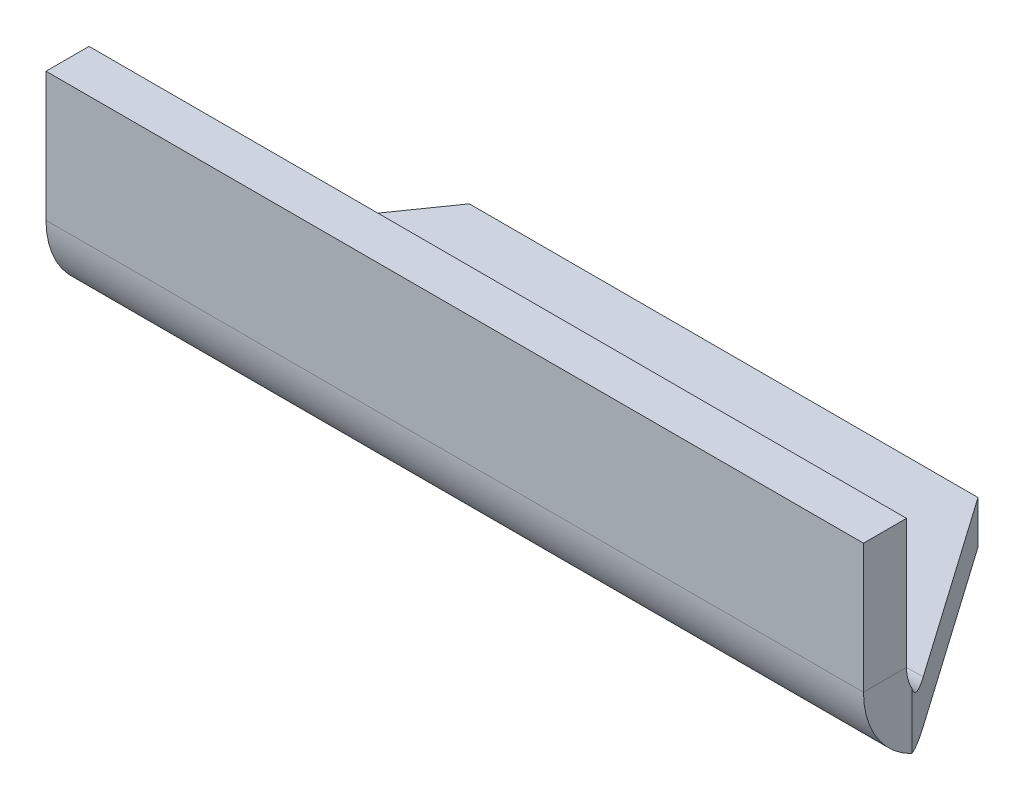
ISO-10303-21;
HEADER;
FILE_DESCRIPTION(('STEP AP214'),'2;1');
FILE_NAME('part.step','',(''),(''),'','','');
FILE_SCHEMA(('AUTOMOTIVE_DESIGN { 1 0 10303 214 1 1 1 1 }'));
ENDSEC;
DATA;
#1=APPLICATION_CONTEXT('core data for automotive mechanical design processes');
#2=APPLICATION_PROTOCOL_DEFINITION('international standard','automotive_design',2000,#1);
#3=PRODUCT_CONTEXT('',#1,'mechanical');
#4=PRODUCT('Part','Part','',(#3));
#5=PRODUCT_RELATED_PRODUCT_CATEGORY('part','',(#4));
#6=PRODUCT_DEFINITION_FORMATION('','',#4);
#7=PRODUCT_DEFINITION_CONTEXT('part definition',#1,'design');
#8=PRODUCT_DEFINITION('design','',#6,#7);
#9=PRODUCT_DEFINITION_SHAPE('','',#8);
#10=(LENGTH_UNIT() NAMED_UNIT(*) SI_UNIT(.MILLI.,.METRE.));
#11=(NAMED_UNIT(*) PLANE_ANGLE_UNIT() SI_UNIT($,.RADIAN.));
#12=(NAMED_UNIT(*) SI_UNIT($,.STERADIAN.) SOLID_ANGLE_UNIT());
#13=UNCERTAINTY_MEASURE_WITH_UNIT(LENGTH_MEASURE(1.E-05),#10,'distance_accuracy_value','');
#14=(GEOMETRIC_REPRESENTATION_CONTEXT(3) GLOBAL_UNCERTAINTY_ASSIGNED_CONTEXT((#13)) GLOBAL_UNIT_ASSIGNED_CONTEXT((#10,
#11,#12)) REPRESENTATION_CONTEXT('',''));
#15=CARTESIAN_POINT('',(0.,0.,0.));
#16=DIRECTION('',(0.,0.,1.));
#17=DIRECTION('',(1.,0.,0.));
#18=AXIS2_PLACEMENT_3D('',#15,#16,#17);
#19=CARTESIAN_POINT('',(0.,-8.,0.));
#20=DIRECTION('',(0.,-1.,0.));
#21=DIRECTION('',(0.,0.,-1.));
#22=AXIS2_PLACEMENT_3D('',#19,#20,#21);
#23=PLANE('',#22);
#24=DIRECTION('',(-1.,0.,0.));
#25=VECTOR('',#24,1.);
#26=CARTESIAN_POINT('',(-76.,-8.,-25.));
#27=LINE('',#26,#25);
#28=CARTESIAN_POINT('',(47.2914909334014,-8.,-25.));
#29=VERTEX_POINT('',#28);
#30=CARTESIAN_POINT('',(-47.2914909334014,-8.,-25.));
#31=VERTEX_POINT('',#30);
#32=EDGE_CURVE('E183',#29,#31,#27,.T.);
#33=ORIENTED_EDGE('',*,*,#32,.F.);
#34=DIRECTION('',(0.573576436351051,0.,0.819152044288988));
#35=VECTOR('',#34,1.);
#36=CARTESIAN_POINT('',(43.4792244800876,-8.,-30.4444807364699));
#37=LINE('',#36,#35);
#38=CARTESIAN_POINT('',(71.0985472325319,-8.00000000000003,9.00000000000002));
#39=VERTEX_POINT('',#38);
#40=EDGE_CURVE('E212',#39,#29,#37,.F.);
#41=ORIENTED_EDGE('',*,*,#40,.F.);
#42=DIRECTION('',(1.,0.,0.));
#43=VECTOR('',#42,1.);
#44=CARTESIAN_POINT('',(76.,-8.00000000000003,9.00000000000002));
#45=LINE('',#44,#43);
#46=CARTESIAN_POINT('',(-71.0985472325319,-8.00000000000003,9.00000000000002));
#47=VERTEX_POINT('',#46);
#48=EDGE_CURVE('E89',#39,#47,#45,.F.);
#49=ORIENTED_EDGE('',*,*,#48,.T.);
#50=DIRECTION('',(-0.573576436351051,0.,0.819152044288988));
#51=VECTOR('',#50,1.);
#52=CARTESIAN_POINT('',(-43.4792244800876,-8.,-30.4444807364699));
#53=LINE('',#52,#51);
#54=EDGE_CURVE('E13',#47,#31,#53,.F.);
#55=ORIENTED_EDGE('',*,*,#54,.T.);
#56=EDGE_LOOP('',(#33,#41,#49,#55));
#57=FACE_BOUND('',#56,.T.);
#58=ADVANCED_FACE('F65',(#57),#23,.T.);
#59=CARTESIAN_POINT('',(0.,0.,0.));
#60=DIRECTION('',(0.,-1.,0.));
#61=DIRECTION('',(0.,0.,-1.));
#62=AXIS2_PLACEMENT_3D('',#59,#60,#61);
#63=PLANE('',#62);
#64=DIRECTION('',(-0.573576436351051,0.,-0.819152044288988));
#65=VECTOR('',#64,1.);
#66=CARTESIAN_POINT('',(47.2914909334014,0.,-25.));
#67=LINE('',#66,#65);
#68=CARTESIAN_POINT('',(47.2914909334014,0.,-25.));
#69=VERTEX_POINT('',#68);
#70=CARTESIAN_POINT('',(71.0985472325319,0.,9.00000000000002));
#71=VERTEX_POINT('',#70);
#72=EDGE_CURVE('E82',#69,#71,#67,.F.);
#73=ORIENTED_EDGE('',*,*,#72,.F.);
#74=DIRECTION('',(-1.,0.,0.));
#75=VECTOR('',#74,1.);
#76=CARTESIAN_POINT('',(-76.,0.,-25.));
#77=LINE('',#76,#75);
#78=CARTESIAN_POINT('',(-47.2914909334014,0.,-25.));
#79=VERTEX_POINT('',#78);
#80=EDGE_CURVE('E187',#69,#79,#77,.T.);
#81=ORIENTED_EDGE('',*,*,#80,.T.);
#82=DIRECTION('',(0.573576436351051,0.,-0.819152044288988));
#83=VECTOR('',#82,1.);
#84=CARTESIAN_POINT('',(-47.2914909334014,0.,-25.));
#85=LINE('',#84,#83);
#86=CARTESIAN_POINT('',(-71.0985472325319,0.,9.00000000000002));
#87=VERTEX_POINT('',#86);
#88=EDGE_CURVE('E193',#79,#87,#85,.F.);
#89=ORIENTED_EDGE('',*,*,#88,.T.);
#90=DIRECTION('',(1.,0.,0.));
#91=VECTOR('',#90,1.);
#92=CARTESIAN_POINT('',(76.,0.,9.00000000000002));
#93=LINE('',#92,#91);
#94=EDGE_CURVE('E173',#71,#87,#93,.F.);
#95=ORIENTED_EDGE('',*,*,#94,.F.);
#96=EDGE_LOOP('',(#73,#81,#89,#95));
#97=FACE_BOUND('',#96,.T.);
#98=ADVANCED_FACE('F301',(#97),#63,.F.);
#99=CARTESIAN_POINT('',(-76.,-8.,-25.));
#100=DIRECTION('',(0.,0.,-1.));
#101=DIRECTION('',(-1.,0.,0.));
#102=AXIS2_PLACEMENT_3D('',#99,#100,#101);
#103=PLANE('',#102);
#104=ORIENTED_EDGE('',*,*,#80,.F.);
#105=DIRECTION('',(0.,1.,0.));
#106=VECTOR('',#105,1.);
#107=CARTESIAN_POINT('',(47.2914909334014,-8.,-25.));
#108=LINE('',#107,#106);
#109=EDGE_CURVE('E217',#29,#69,#108,.T.);
#110=ORIENTED_EDGE('',*,*,#109,.F.);
#111=ORIENTED_EDGE('',*,*,#32,.T.);
#112=DIRECTION('',(0.,1.,0.));
#113=VECTOR('',#112,1.);
#114=CARTESIAN_POINT('',(-47.2914909334014,-8.,-25.));
#115=LINE('',#114,#113);
#116=EDGE_CURVE('E186',#31,#79,#115,.T.);
#117=ORIENTED_EDGE('',*,*,#116,.T.);
#118=EDGE_LOOP('',(#104,#110,#111,#117));
#119=FACE_BOUND('',#118,.T.);
#120=ADVANCED_FACE('F216',(#119),#103,.T.);
#121=CARTESIAN_POINT('',(76.,7.99999999999997,9.00000000000002));
#122=DIRECTION('',(-1.,0.,0.));
#123=DIRECTION('',(0.,0.,1.));
#124=AXIS2_PLACEMENT_3D('',#121,#122,#123);
#125=PLANE('',#124);
#126=CARTESIAN_POINT('',(76.,7.99999999999997,9.00000000000002));
#127=DIRECTION('',(1.,0.,0.));
#128=DIRECTION('',(0.,0.,-1.));
#129=AXIS2_PLACEMENT_3D('',#126,#127,#128);
#130=CIRCLE('',#129,16.);
#131=CARTESIAN_POINT('',(76.,7.99999999999997,25.));
#132=VERTEX_POINT('',#131);
#133=CARTESIAN_POINT('',(76.,-6.3874945699381,16.0000000000002));
#134=VERTEX_POINT('',#133);
#135=EDGE_CURVE('E157',#132,#134,#130,.T.);
#136=ORIENTED_EDGE('',*,*,#135,.T.);
#137=DIRECTION('',(0.,-1.,0.));
#138=VECTOR('',#137,1.);
#139=CARTESIAN_POINT('',(76.,7.99999999999997,16.0000000000002));
#140=LINE('',#139,#138);
#141=CARTESIAN_POINT('',(76.,4.12701665379289,16.0000000000002));
#142=VERTEX_POINT('',#141);
#143=EDGE_CURVE('E143',#142,#134,#140,.T.);
#144=ORIENTED_EDGE('',*,*,#143,.F.);
#145=CARTESIAN_POINT('',(76.,7.99999999999997,9.00000000000002));
#146=DIRECTION('',(1.,0.,0.));
#147=DIRECTION('',(0.,0.,-1.));
#148=AXIS2_PLACEMENT_3D('',#145,#146,#147);
#149=CIRCLE('',#148,8.);
#150=CARTESIAN_POINT('',(76.,7.99999999999997,17.));
#151=VERTEX_POINT('',#150);
#152=EDGE_CURVE('E179',#151,#142,#149,.T.);
#153=ORIENTED_EDGE('',*,*,#152,.F.);
#154=DIRECTION('',(0.,0.,-1.));
#155=VECTOR('',#154,1.);
#156=CARTESIAN_POINT('',(76.,7.99999999999997,17.));
#157=LINE('',#156,#155);
#158=EDGE_CURVE('E163',#151,#132,#157,.F.);
#159=ORIENTED_EDGE('',*,*,#158,.T.);
#160=EDGE_LOOP('',(#136,#144,#153,#159));
#161=FACE_BOUND('',#160,.T.);
#162=ADVANCED_FACE('F161',(#161),#125,.F.);
#163=CARTESIAN_POINT('',(76.,7.99999999999997,9.00000000000002));
#164=DIRECTION('',(1.,0.,0.));
#165=DIRECTION('',(0.,0.,1.));
#166=AXIS2_PLACEMENT_3D('',#163,#164,#165);
#167=CYLINDRICAL_SURFACE('',#166,16.);
#168=ORIENTED_EDGE('',*,*,#48,.F.);
#169=CARTESIAN_POINT('',(71.0985472325319,7.99999999999997,9.00000000000002));
#170=DIRECTION('',(0.819152044288988,0.,-0.573576436351051));
#171=DIRECTION('',(-0.573576436351051,0.,-0.819152044288988));
#172=AXIS2_PLACEMENT_3D('',#169,#170,#171);
#173=ELLIPSE('',#172,19.5323934201834,16.);
#174=EDGE_CURVE('E146',#134,#39,#173,.T.);
#175=ORIENTED_EDGE('',*,*,#174,.F.);
#176=ORIENTED_EDGE('',*,*,#135,.F.);
#177=DIRECTION('',(1.,0.,0.));
#178=VECTOR('',#177,1.);
#179=CARTESIAN_POINT('',(-76.,7.99999999999997,25.));
#180=LINE('',#179,#178);
#181=CARTESIAN_POINT('',(-76.,7.99999999999997,25.));
#182=VERTEX_POINT('',#181);
#183=EDGE_CURVE('E255',#132,#182,#180,.F.);
#184=ORIENTED_EDGE('',*,*,#183,.T.);
#185=CARTESIAN_POINT('',(-76.,7.99999999999997,9.00000000000002));
#186=DIRECTION('',(1.,0.,0.));
#187=DIRECTION('',(0.,0.,-1.));
#188=AXIS2_PLACEMENT_3D('',#185,#186,#187);
#189=CIRCLE('',#188,16.);
#190=CARTESIAN_POINT('',(-76.,-6.3874945699381,16.0000000000002));
#191=VERTEX_POINT('',#190);
#192=EDGE_CURVE('E171',#191,#182,#189,.F.);
#193=ORIENTED_EDGE('',*,*,#192,.F.);
#194=CARTESIAN_POINT('',(-71.0985472325319,7.99999999999997,9.00000000000002));
#195=DIRECTION('',(0.819152044288988,0.,0.573576436351051));
#196=DIRECTION('',(0.573576436351051,0.,-0.819152044288988));
#197=AXIS2_PLACEMENT_3D('',#194,#195,#196);
#198=ELLIPSE('',#197,19.5323934201834,16.);
#199=EDGE_CURVE('E75',#191,#47,#198,.T.);
#200=ORIENTED_EDGE('',*,*,#199,.T.);
#201=EDGE_LOOP('',(#168,#175,#176,#184,#193,#200));
#202=FACE_BOUND('',#201,.T.);
#203=ADVANCED_FACE('F155',(#202),#167,.T.);
#204=CARTESIAN_POINT('',(76.,7.99999999999997,9.00000000000002));
#205=DIRECTION('',(1.,0.,0.));
#206=DIRECTION('',(0.,0.,1.));
#207=AXIS2_PLACEMENT_3D('',#204,#205,#206);
#208=CYLINDRICAL_SURFACE('',#207,8.);
#209=CARTESIAN_POINT('',(71.0985472325319,7.99999999999997,9.00000000000002));
#210=DIRECTION('',(0.819152044288988,0.,-0.573576436351051));
#211=DIRECTION('',(-0.573576436351051,0.,-0.819152044288988));
#212=AXIS2_PLACEMENT_3D('',#209,#210,#211);
#213=ELLIPSE('',#212,9.76619671009169,8.);
#214=EDGE_CURVE('E147',#71,#142,#213,.F.);
#215=ORIENTED_EDGE('',*,*,#214,.F.);
#216=ORIENTED_EDGE('',*,*,#94,.T.);
#217=CARTESIAN_POINT('',(-71.0985472325319,7.99999999999997,9.00000000000002));
#218=DIRECTION('',(0.819152044288988,0.,0.573576436351051));
#219=DIRECTION('',(0.573576436351051,0.,-0.819152044288988));
#220=AXIS2_PLACEMENT_3D('',#217,#218,#219);
#221=ELLIPSE('',#220,9.76619671009169,8.);
#222=CARTESIAN_POINT('',(-76.,4.12701665379289,16.0000000000002));
#223=VERTEX_POINT('',#222);
#224=EDGE_CURVE('E197',#87,#223,#221,.F.);
#225=ORIENTED_EDGE('',*,*,#224,.T.);
#226=CARTESIAN_POINT('',(-76.,7.99999999999997,9.00000000000002));
#227=DIRECTION('',(1.,0.,0.));
#228=DIRECTION('',(0.,0.,-1.));
#229=AXIS2_PLACEMENT_3D('',#226,#227,#228);
#230=CIRCLE('',#229,8.);
#231=CARTESIAN_POINT('',(-76.,7.99999999999997,17.));
#232=VERTEX_POINT('',#231);
#233=EDGE_CURVE('E166',#223,#232,#230,.F.);
#234=ORIENTED_EDGE('',*,*,#233,.T.);
#235=DIRECTION('',(1.,0.,0.));
#236=VECTOR('',#235,1.);
#237=CARTESIAN_POINT('',(-76.,7.99999999999997,17.));
#238=LINE('',#237,#236);
#239=EDGE_CURVE('E260',#232,#151,#238,.T.);
#240=ORIENTED_EDGE('',*,*,#239,.T.);
#241=ORIENTED_EDGE('',*,*,#152,.T.);
#242=EDGE_LOOP('',(#215,#216,#225,#234,#240,#241));
#243=FACE_BOUND('',#242,.T.);
#244=ADVANCED_FACE('F287',(#243),#208,.F.);
#245=CARTESIAN_POINT('',(-76.,7.99999999999997,9.00000000000002));
#246=DIRECTION('',(-1.,0.,0.));
#247=DIRECTION('',(0.,0.,1.));
#248=AXIS2_PLACEMENT_3D('',#245,#246,#247);
#249=PLANE('',#248);
#250=ORIENTED_EDGE('',*,*,#233,.F.);
#251=DIRECTION('',(0.,-1.,0.));
#252=VECTOR('',#251,1.);
#253=CARTESIAN_POINT('',(-76.,7.99999999999997,16.0000000000002));
#254=LINE('',#253,#252);
#255=EDGE_CURVE('E200',#223,#191,#254,.T.);
#256=ORIENTED_EDGE('',*,*,#255,.T.);
#257=ORIENTED_EDGE('',*,*,#192,.T.);
#258=DIRECTION('',(0.,0.,-1.));
#259=VECTOR('',#258,1.);
#260=CARTESIAN_POINT('',(-76.,7.99999999999997,25.));
#261=LINE('',#260,#259);
#262=EDGE_CURVE('E223',#232,#182,#261,.F.);
#263=ORIENTED_EDGE('',*,*,#262,.F.);
#264=EDGE_LOOP('',(#250,#256,#257,#263));
#265=FACE_BOUND('',#264,.T.);
#266=ADVANCED_FACE('F297',(#265),#249,.T.);
#267=CARTESIAN_POINT('',(-76.,0.,25.));
#268=DIRECTION('',(1.,0.,0.));
#269=DIRECTION('',(0.,1.,0.));
#270=AXIS2_PLACEMENT_3D('',#267,#268,#269);
#271=PLANE('',#270);
#272=ORIENTED_EDGE('',*,*,#262,.T.);
#273=DIRECTION('',(0.,-1.,0.));
#274=VECTOR('',#273,1.);
#275=CARTESIAN_POINT('',(-76.,0.,25.));
#276=LINE('',#275,#274);
#277=CARTESIAN_POINT('',(-76.,32.,25.));
#278=VERTEX_POINT('',#277);
#279=EDGE_CURVE('E241',#278,#182,#276,.T.);
#280=ORIENTED_EDGE('',*,*,#279,.F.);
#281=DIRECTION('',(0.,0.,-1.));
#282=VECTOR('',#281,1.);
#283=CARTESIAN_POINT('',(-76.,32.,25.));
#284=LINE('',#283,#282);
#285=CARTESIAN_POINT('',(-76.,32.,17.));
#286=VERTEX_POINT('',#285);
#287=EDGE_CURVE('E231',#278,#286,#284,.T.);
#288=ORIENTED_EDGE('',*,*,#287,.T.);
#289=DIRECTION('',(0.,1.,0.));
#290=VECTOR('',#289,1.);
#291=CARTESIAN_POINT('',(-76.,0.,17.));
#292=LINE('',#291,#290);
#293=EDGE_CURVE('E251',#286,#232,#292,.F.);
#294=ORIENTED_EDGE('',*,*,#293,.T.);
#295=EDGE_LOOP('',(#272,#280,#288,#294));
#296=FACE_BOUND('',#295,.T.);
#297=ADVANCED_FACE('F269',(#296),#271,.F.);
#298=CARTESIAN_POINT('',(76.,32.,25.));
#299=DIRECTION('',(-1.,0.,0.));
#300=DIRECTION('',(0.,-1.,0.));
#301=AXIS2_PLACEMENT_3D('',#298,#299,#300);
#302=PLANE('',#301);
#303=ORIENTED_EDGE('',*,*,#158,.F.);
#304=DIRECTION('',(0.,-1.,0.));
#305=VECTOR('',#304,1.);
#306=CARTESIAN_POINT('',(76.,32.,17.));
#307=LINE('',#306,#305);
#308=CARTESIAN_POINT('',(76.,32.,17.));
#309=VERTEX_POINT('',#308);
#310=EDGE_CURVE('E248',#151,#309,#307,.F.);
#311=ORIENTED_EDGE('',*,*,#310,.T.);
#312=DIRECTION('',(0.,0.,-1.));
#313=VECTOR('',#312,1.);
#314=CARTESIAN_POINT('',(76.,32.,25.));
#315=LINE('',#314,#313);
#316=CARTESIAN_POINT('',(76.,32.,25.));
#317=VERTEX_POINT('',#316);
#318=EDGE_CURVE('E182',#317,#309,#315,.T.);
#319=ORIENTED_EDGE('',*,*,#318,.F.);
#320=DIRECTION('',(0.,1.,0.));
#321=VECTOR('',#320,1.);
#322=CARTESIAN_POINT('',(76.,-1.31838984174237E-13,25.));
#323=LINE('',#322,#321);
#324=EDGE_CURVE('E238',#132,#317,#323,.T.);
#325=ORIENTED_EDGE('',*,*,#324,.F.);
#326=EDGE_LOOP('',(#303,#311,#319,#325));
#327=FACE_BOUND('',#326,.T.);
#328=ADVANCED_FACE('F289',(#327),#302,.F.);
#329=CARTESIAN_POINT('',(0.,0.,25.));
#330=DIRECTION('',(0.,0.,-1.));
#331=DIRECTION('',(-1.,0.,0.));
#332=AXIS2_PLACEMENT_3D('',#329,#330,#331);
#333=PLANE('',#332);
#334=ORIENTED_EDGE('',*,*,#183,.F.);
#335=ORIENTED_EDGE('',*,*,#324,.T.);
#336=DIRECTION('',(-1.,0.,0.));
#337=VECTOR('',#336,1.);
#338=CARTESIAN_POINT('',(0.,32.,25.));
#339=LINE('',#338,#337);
#340=EDGE_CURVE('E235',#317,#278,#339,.T.);
#341=ORIENTED_EDGE('',*,*,#340,.T.);
#342=ORIENTED_EDGE('',*,*,#279,.T.);
#343=EDGE_LOOP('',(#334,#335,#341,#342));
#344=FACE_BOUND('',#343,.T.);
#345=ADVANCED_FACE('F275',(#344),#333,.F.);
#346=CARTESIAN_POINT('',(0.,0.,17.));
#347=DIRECTION('',(0.,0.,-1.));
#348=DIRECTION('',(-1.,0.,0.));
#349=AXIS2_PLACEMENT_3D('',#346,#347,#348);
#350=PLANE('',#349);
#351=ORIENTED_EDGE('',*,*,#310,.F.);
#352=ORIENTED_EDGE('',*,*,#239,.F.);
#353=ORIENTED_EDGE('',*,*,#293,.F.);
#354=DIRECTION('',(1.,0.,0.));
#355=VECTOR('',#354,1.);
#356=CARTESIAN_POINT('',(-76.,32.,17.));
#357=LINE('',#356,#355);
#358=EDGE_CURVE('E245',#309,#286,#357,.F.);
#359=ORIENTED_EDGE('',*,*,#358,.F.);
#360=EDGE_LOOP('',(#351,#352,#353,#359));
#361=FACE_BOUND('',#360,.T.);
#362=ADVANCED_FACE('F285',(#361),#350,.T.);
#363=CARTESIAN_POINT('',(-76.,32.,25.));
#364=DIRECTION('',(0.,-1.,0.));
#365=DIRECTION('',(0.,0.,-1.));
#366=AXIS2_PLACEMENT_3D('',#363,#364,#365);
#367=PLANE('',#366);
#368=ORIENTED_EDGE('',*,*,#358,.T.);
#369=ORIENTED_EDGE('',*,*,#287,.F.);
#370=ORIENTED_EDGE('',*,*,#340,.F.);
#371=ORIENTED_EDGE('',*,*,#318,.T.);
#372=EDGE_LOOP('',(#368,#369,#370,#371));
#373=FACE_BOUND('',#372,.T.);
#374=ADVANCED_FACE('F281',(#373),#367,.F.);
#375=CARTESIAN_POINT('',(-47.2914909334014,-8.,-25.));
#376=DIRECTION('',(0.819152044288988,0.,0.573576436351051));
#377=DIRECTION('',(0.,1.,0.));
#378=AXIS2_PLACEMENT_3D('',#375,#376,#377);
#379=PLANE('',#378);
#380=ORIENTED_EDGE('',*,*,#199,.F.);
#381=ORIENTED_EDGE('',*,*,#255,.F.);
#382=ORIENTED_EDGE('',*,*,#224,.F.);
#383=ORIENTED_EDGE('',*,*,#88,.F.);
#384=ORIENTED_EDGE('',*,*,#116,.F.);
#385=ORIENTED_EDGE('',*,*,#54,.F.);
#386=EDGE_LOOP('',(#380,#381,#382,#383,#384,#385));
#387=FACE_BOUND('',#386,.T.);
#388=ADVANCED_FACE('F68',(#387),#379,.F.);
#389=CARTESIAN_POINT('',(47.2914909334014,-8.,-25.));
#390=DIRECTION('',(-0.819152044288988,0.,0.573576436351051));
#391=DIRECTION('',(0.,1.,0.));
#392=AXIS2_PLACEMENT_3D('',#389,#390,#391);
#393=PLANE('',#392);
#394=ORIENTED_EDGE('',*,*,#174,.T.);
#395=ORIENTED_EDGE('',*,*,#40,.T.);
#396=ORIENTED_EDGE('',*,*,#109,.T.);
#397=ORIENTED_EDGE('',*,*,#72,.T.);
#398=ORIENTED_EDGE('',*,*,#214,.T.);
#399=ORIENTED_EDGE('',*,*,#143,.T.);
#400=EDGE_LOOP('',(#394,#395,#396,#397,#398,#399));
#401=FACE_BOUND('',#400,.T.);
#402=ADVANCED_FACE('F145',(#401),#393,.F.);
#403=CLOSED_SHELL('',(#58,#98,#120,#162,#203,#244,#266,#297,#328,#345,#362,#374,#388,#402));
#404=MANIFOLD_SOLID_BREP('B2',#403);
#405=ADVANCED_BREP_SHAPE_REPRESENTATION('',(#18,#404),#14);
#406=SHAPE_DEFINITION_REPRESENTATION(#9,#405);
ENDSEC;
END-ISO-10303-21;
